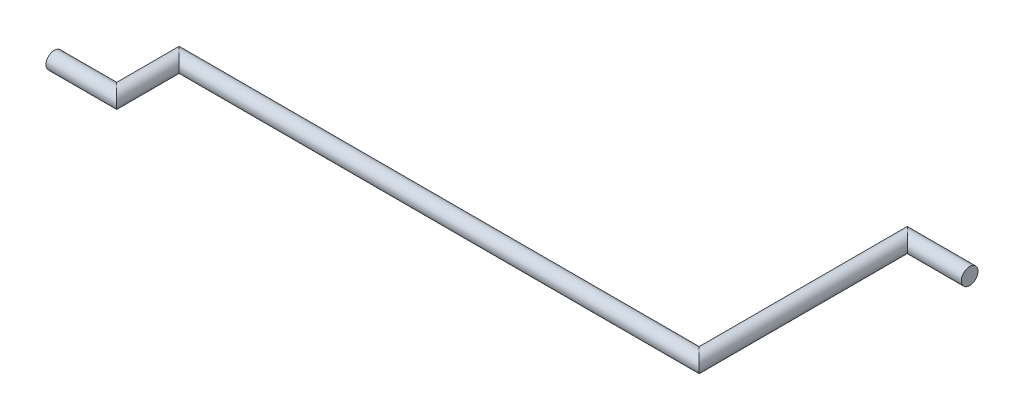
ISO-10303-21;
HEADER;
FILE_DESCRIPTION(('STEP AP214'),'2;1');
FILE_NAME('part.step','',(''),(''),'','','');
FILE_SCHEMA(('AUTOMOTIVE_DESIGN { 1 0 10303 214 1 1 1 1 }'));
ENDSEC;
DATA;
#1=APPLICATION_CONTEXT('core data for automotive mechanical design processes');
#2=APPLICATION_PROTOCOL_DEFINITION('international standard','automotive_design',2000,#1);
#3=PRODUCT_CONTEXT('',#1,'mechanical');
#4=PRODUCT('Part','Part','',(#3));
#5=PRODUCT_RELATED_PRODUCT_CATEGORY('part','',(#4));
#6=PRODUCT_DEFINITION_FORMATION('','',#4);
#7=PRODUCT_DEFINITION_CONTEXT('part definition',#1,'design');
#8=PRODUCT_DEFINITION('design','',#6,#7);
#9=PRODUCT_DEFINITION_SHAPE('','',#8);
#10=(LENGTH_UNIT() NAMED_UNIT(*) SI_UNIT(.MILLI.,.METRE.));
#11=(NAMED_UNIT(*) PLANE_ANGLE_UNIT() SI_UNIT($,.RADIAN.));
#12=(NAMED_UNIT(*) SI_UNIT($,.STERADIAN.) SOLID_ANGLE_UNIT());
#13=UNCERTAINTY_MEASURE_WITH_UNIT(LENGTH_MEASURE(1.E-05),#10,'distance_accuracy_value','');
#14=(GEOMETRIC_REPRESENTATION_CONTEXT(3) GLOBAL_UNCERTAINTY_ASSIGNED_CONTEXT((#13)) GLOBAL_UNIT_ASSIGNED_CONTEXT((#10,
#11,#12)) REPRESENTATION_CONTEXT('',''));
#15=CARTESIAN_POINT('',(0.,0.,0.));
#16=DIRECTION('',(0.,0.,1.));
#17=DIRECTION('',(1.,0.,0.));
#18=AXIS2_PLACEMENT_3D('',#15,#16,#17);
#19=CARTESIAN_POINT('',(31.,0.,-13.));
#20=DIRECTION('',(1.,0.,0.));
#21=DIRECTION('',(0.,0.,-1.));
#22=AXIS2_PLACEMENT_3D('',#19,#20,#21);
#23=PLANE('',#22);
#24=CARTESIAN_POINT('',(31.,0.,-13.));
#25=DIRECTION('',(1.,0.,0.));
#26=DIRECTION('',(0.,0.,-1.));
#27=AXIS2_PLACEMENT_3D('',#24,#25,#26);
#28=CIRCLE('',#27,0.4);
#29=CARTESIAN_POINT('',(31.,0.,-13.4));
#30=VERTEX_POINT('',#29);
#31=EDGE_CURVE('E40',#30,#30,#28,.T.);
#32=ORIENTED_EDGE('',*,*,#31,.T.);
#33=EDGE_LOOP('',(#32));
#34=FACE_BOUND('',#33,.T.);
#35=ADVANCED_FACE('F37',(#34),#23,.T.);
#36=CARTESIAN_POINT('',(0.,0.,0.));
#37=DIRECTION('',(1.,0.,0.));
#38=DIRECTION('',(0.,0.,-1.));
#39=AXIS2_PLACEMENT_3D('',#36,#37,#38);
#40=PLANE('',#39);
#41=CARTESIAN_POINT('',(0.,0.,0.));
#42=DIRECTION('',(1.,0.,0.));
#43=DIRECTION('',(0.,0.,-1.));
#44=AXIS2_PLACEMENT_3D('',#41,#42,#43);
#45=CIRCLE('',#44,0.4);
#46=CARTESIAN_POINT('',(0.,0.,-0.4));
#47=VERTEX_POINT('',#46);
#48=EDGE_CURVE('E44',#47,#47,#45,.T.);
#49=ORIENTED_EDGE('',*,*,#48,.F.);
#50=EDGE_LOOP('',(#49));
#51=FACE_BOUND('',#50,.T.);
#52=ADVANCED_FACE('F67',(#51),#40,.F.);
#53=CARTESIAN_POINT('',(27.46,0.,-13.));
#54=DIRECTION('',(1.,0.,0.));
#55=DIRECTION('',(0.,0.,-1.));
#56=AXIS2_PLACEMENT_3D('',#53,#54,#55);
#57=CYLINDRICAL_SURFACE('',#56,0.4);
#58=CARTESIAN_POINT('',(28.,0.,-13.));
#59=DIRECTION('',(0.707106781186548,0.,-0.707106781186547));
#60=DIRECTION('',(-0.707106781186547,0.,-0.707106781186548));
#61=AXIS2_PLACEMENT_3D('',#58,#59,#60);
#62=ELLIPSE('',#61,0.565685424949238,0.4);
#63=CARTESIAN_POINT('',(27.6,0.,-13.4));
#64=VERTEX_POINT('',#63);
#65=EDGE_CURVE('E56',#64,#64,#62,.F.);
#66=ORIENTED_EDGE('',*,*,#65,.F.);
#67=EDGE_LOOP('',(#66));
#68=FACE_BOUND('',#67,.T.);
#69=ORIENTED_EDGE('',*,*,#31,.F.);
#70=EDGE_LOOP('',(#69));
#71=FACE_BOUND('',#70,.T.);
#72=ADVANCED_FACE('F64',(#68,#71),#57,.T.);
#73=CARTESIAN_POINT('',(28.,0.,-2.46));
#74=DIRECTION('',(0.,0.,-1.));
#75=DIRECTION('',(-1.,0.,0.));
#76=AXIS2_PLACEMENT_3D('',#73,#74,#75);
#77=CYLINDRICAL_SURFACE('',#76,0.4);
#78=CARTESIAN_POINT('',(28.,0.,-3.));
#79=DIRECTION('',(0.707106781186548,0.,-0.707106781186548));
#80=DIRECTION('',(0.707106781186548,0.,0.707106781186548));
#81=AXIS2_PLACEMENT_3D('',#78,#79,#80);
#82=ELLIPSE('',#81,0.565685424949238,0.4);
#83=CARTESIAN_POINT('',(28.4,0.,-2.6));
#84=VERTEX_POINT('',#83);
#85=EDGE_CURVE('E54',#84,#84,#82,.F.);
#86=ORIENTED_EDGE('',*,*,#85,.F.);
#87=EDGE_LOOP('',(#86));
#88=FACE_BOUND('',#87,.T.);
#89=ORIENTED_EDGE('',*,*,#65,.T.);
#90=EDGE_LOOP('',(#89));
#91=FACE_BOUND('',#90,.T.);
#92=ADVANCED_FACE('F66',(#88,#91),#77,.T.);
#93=CARTESIAN_POINT('',(2.46,0.,-3.));
#94=DIRECTION('',(1.,0.,0.));
#95=DIRECTION('',(0.,0.,-1.));
#96=AXIS2_PLACEMENT_3D('',#93,#94,#95);
#97=CYLINDRICAL_SURFACE('',#96,0.4);
#98=CARTESIAN_POINT('',(3.,0.,-3.));
#99=DIRECTION('',(0.707106781186548,0.,-0.707106781186548));
#100=DIRECTION('',(-0.707106781186548,0.,-0.707106781186548));
#101=AXIS2_PLACEMENT_3D('',#98,#99,#100);
#102=ELLIPSE('',#101,0.565685424949238,0.4);
#103=CARTESIAN_POINT('',(2.6,0.,-3.4));
#104=VERTEX_POINT('',#103);
#105=EDGE_CURVE('E49',#104,#104,#102,.F.);
#106=ORIENTED_EDGE('',*,*,#105,.F.);
#107=EDGE_LOOP('',(#106));
#108=FACE_BOUND('',#107,.T.);
#109=ORIENTED_EDGE('',*,*,#85,.T.);
#110=EDGE_LOOP('',(#109));
#111=FACE_BOUND('',#110,.T.);
#112=ADVANCED_FACE('F74',(#108,#111),#97,.T.);
#113=CARTESIAN_POINT('',(3.,0.,0.54));
#114=DIRECTION('',(0.,0.,-1.));
#115=DIRECTION('',(-1.,0.,0.));
#116=AXIS2_PLACEMENT_3D('',#113,#114,#115);
#117=CYLINDRICAL_SURFACE('',#116,0.4);
#118=CARTESIAN_POINT('',(3.,0.,0.));
#119=DIRECTION('',(0.707106781186547,0.,-0.707106781186547));
#120=DIRECTION('',(0.707106781186548,0.,0.707106781186548));
#121=AXIS2_PLACEMENT_3D('',#118,#119,#120);
#122=ELLIPSE('',#121,0.565685424949238,0.4);
#123=CARTESIAN_POINT('',(3.4,0.,0.4));
#124=VERTEX_POINT('',#123);
#125=EDGE_CURVE('E10',#124,#124,#122,.F.);
#126=ORIENTED_EDGE('',*,*,#125,.F.);
#127=EDGE_LOOP('',(#126));
#128=FACE_BOUND('',#127,.T.);
#129=ORIENTED_EDGE('',*,*,#105,.T.);
#130=EDGE_LOOP('',(#129));
#131=FACE_BOUND('',#130,.T.);
#132=ADVANCED_FACE('F80',(#128,#131),#117,.T.);
#133=CARTESIAN_POINT('',(0.,0.,0.));
#134=DIRECTION('',(1.,0.,0.));
#135=DIRECTION('',(0.,0.,-1.));
#136=AXIS2_PLACEMENT_3D('',#133,#134,#135);
#137=CYLINDRICAL_SURFACE('',#136,0.4);
#138=ORIENTED_EDGE('',*,*,#48,.T.);
#139=EDGE_LOOP('',(#138));
#140=FACE_BOUND('',#139,.T.);
#141=ORIENTED_EDGE('',*,*,#125,.T.);
#142=EDGE_LOOP('',(#141));
#143=FACE_BOUND('',#142,.T.);
#144=ADVANCED_FACE('F78',(#140,#143),#137,.T.);
#145=CLOSED_SHELL('',(#35,#52,#72,#92,#112,#132,#144));
#146=MANIFOLD_SOLID_BREP('B2',#145);
#147=ADVANCED_BREP_SHAPE_REPRESENTATION('',(#18,#146),#14);
#148=SHAPE_DEFINITION_REPRESENTATION(#9,#147);
ENDSEC;
END-ISO-10303-21;
